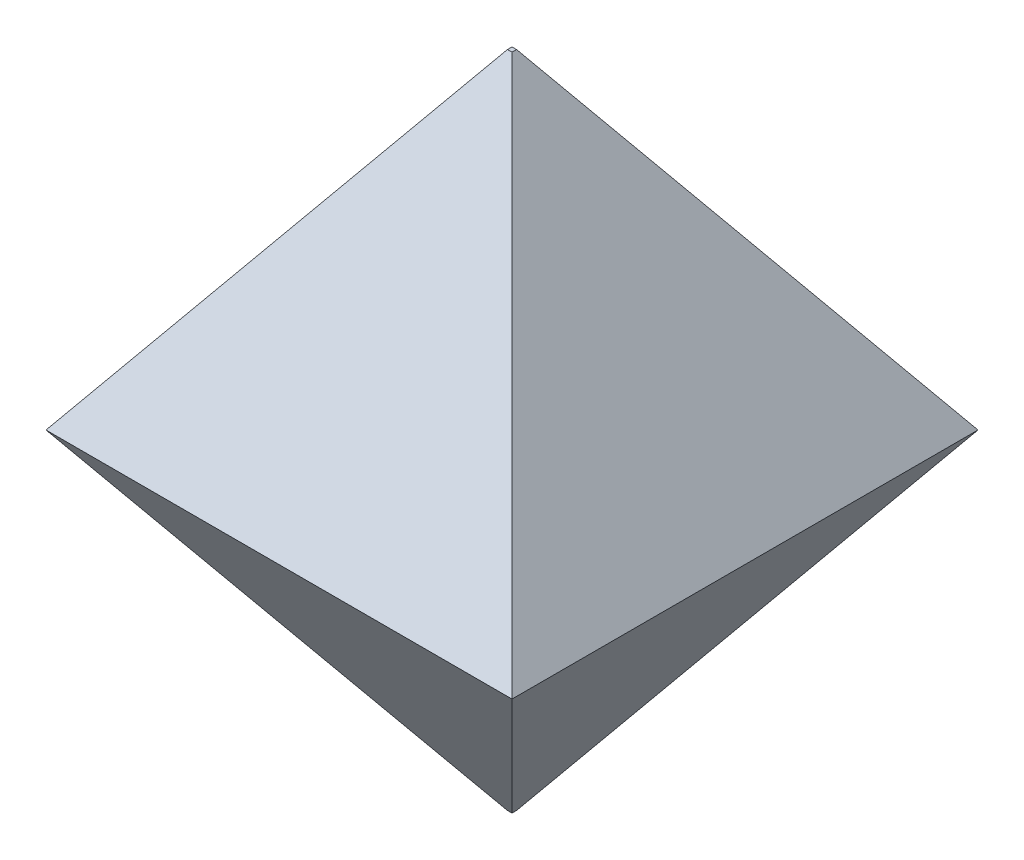
ISO-10303-21;
HEADER;
FILE_DESCRIPTION(('STEP AP214'),'2;1');
FILE_NAME('part.step','',(''),(''),'','','');
FILE_SCHEMA(('AUTOMOTIVE_DESIGN { 1 0 10303 214 1 1 1 1 }'));
ENDSEC;
DATA;
#1=APPLICATION_CONTEXT('core data for automotive mechanical design processes');
#2=APPLICATION_PROTOCOL_DEFINITION('international standard','automotive_design',2000,#1);
#3=PRODUCT_CONTEXT('',#1,'mechanical');
#4=PRODUCT('Part','Part','',(#3));
#5=PRODUCT_RELATED_PRODUCT_CATEGORY('part','',(#4));
#6=PRODUCT_DEFINITION_FORMATION('','',#4);
#7=PRODUCT_DEFINITION_CONTEXT('part definition',#1,'design');
#8=PRODUCT_DEFINITION('design','',#6,#7);
#9=PRODUCT_DEFINITION_SHAPE('','',#8);
#10=(LENGTH_UNIT() NAMED_UNIT(*) SI_UNIT(.MILLI.,.METRE.));
#11=(NAMED_UNIT(*) PLANE_ANGLE_UNIT() SI_UNIT($,.RADIAN.));
#12=(NAMED_UNIT(*) SI_UNIT($,.STERADIAN.) SOLID_ANGLE_UNIT());
#13=UNCERTAINTY_MEASURE_WITH_UNIT(LENGTH_MEASURE(1.E-05),#10,'distance_accuracy_value','');
#14=(GEOMETRIC_REPRESENTATION_CONTEXT(3) GLOBAL_UNCERTAINTY_ASSIGNED_CONTEXT((#13)) GLOBAL_UNIT_ASSIGNED_CONTEXT((#10,
#11,#12)) REPRESENTATION_CONTEXT('',''));
#15=CARTESIAN_POINT('',(0.,0.,0.));
#16=DIRECTION('',(0.,0.,1.));
#17=DIRECTION('',(1.,0.,0.));
#18=AXIS2_PLACEMENT_3D('',#15,#16,#17);
#19=CARTESIAN_POINT('',(0.,0.,0.));
#20=DIRECTION('',(-0.819152044288991,-0.573576436351046,0.));
#21=DIRECTION('',(0.573576436351046,-0.819152044288991,0.));
#22=AXIS2_PLACEMENT_3D('',#19,#20,#21);
#23=PLANE('',#22);
#24=DIRECTION('',(0.,0.,1.));
#25=VECTOR('',#24,1.);
#26=CARTESIAN_POINT('',(0.,0.,0.));
#27=LINE('',#26,#25);
#28=CARTESIAN_POINT('',(0.,0.,0.));
#29=VERTEX_POINT('',#28);
#30=CARTESIAN_POINT('',(0.,0.,25.4));
#31=VERTEX_POINT('',#30);
#32=EDGE_CURVE('E93',#29,#31,#27,.T.);
#33=ORIENTED_EDGE('',*,*,#32,.F.);
#34=DIRECTION('',(-0.497542812164523,0.710564775461629,-0.497542812164523));
#35=VECTOR('',#34,1.);
#36=CARTESIAN_POINT('',(0.,0.,0.));
#37=LINE('',#36,#35);
#38=CARTESIAN_POINT('',(12.5757273862464,-17.96,12.5757273862464));
#39=VERTEX_POINT('',#38);
#40=EDGE_CURVE('E11',#39,#29,#37,.T.);
#41=ORIENTED_EDGE('',*,*,#40,.F.);
#42=DIRECTION('',(0.,0.,1.));
#43=VECTOR('',#42,1.);
#44=CARTESIAN_POINT('',(12.5757273862464,-17.96,0.));
#45=LINE('',#44,#43);
#46=CARTESIAN_POINT('',(12.5757273862464,-17.96,12.8242726137536));
#47=VERTEX_POINT('',#46);
#48=EDGE_CURVE('E116',#39,#47,#45,.T.);
#49=ORIENTED_EDGE('',*,*,#48,.T.);
#50=DIRECTION('',(-0.497542812164523,0.710564775461629,0.497542812164523));
#51=VECTOR('',#50,1.);
#52=CARTESIAN_POINT('',(6.28774078838918,-8.97982447384909,19.1122592116108));
#53=LINE('',#52,#51);
#54=EDGE_CURVE('E71',#47,#31,#53,.T.);
#55=ORIENTED_EDGE('',*,*,#54,.T.);
#56=EDGE_LOOP('',(#33,#41,#49,#55));
#57=FACE_BOUND('',#56,.T.);
#58=ADVANCED_FACE('F34',(#57),#23,.T.);
#59=CARTESIAN_POINT('',(0.,0.,0.));
#60=DIRECTION('',(0.,-0.573576436351046,-0.819152044288991));
#61=DIRECTION('',(0.,0.819152044288991,-0.573576436351046));
#62=AXIS2_PLACEMENT_3D('',#59,#60,#61);
#63=PLANE('',#62);
#64=DIRECTION('',(-1.,0.,0.));
#65=VECTOR('',#64,1.);
#66=CARTESIAN_POINT('',(0.,0.,0.));
#67=LINE('',#66,#65);
#68=CARTESIAN_POINT('',(25.4,0.,0.));
#69=VERTEX_POINT('',#68);
#70=EDGE_CURVE('E103',#69,#29,#67,.T.);
#71=ORIENTED_EDGE('',*,*,#70,.F.);
#72=DIRECTION('',(0.497542812164523,0.710564775461629,-0.497542812164523));
#73=VECTOR('',#72,1.);
#74=CARTESIAN_POINT('',(25.4,0.,0.));
#75=LINE('',#74,#73);
#76=CARTESIAN_POINT('',(12.8242726137536,-17.96,12.5757273862464));
#77=VERTEX_POINT('',#76);
#78=EDGE_CURVE('E44',#77,#69,#75,.T.);
#79=ORIENTED_EDGE('',*,*,#78,.F.);
#80=DIRECTION('',(-1.,0.,0.));
#81=VECTOR('',#80,1.);
#82=CARTESIAN_POINT('',(0.,-17.96,12.5757273862464));
#83=LINE('',#82,#81);
#84=EDGE_CURVE('E106',#77,#39,#83,.T.);
#85=ORIENTED_EDGE('',*,*,#84,.T.);
#86=ORIENTED_EDGE('',*,*,#40,.T.);
#87=EDGE_LOOP('',(#71,#79,#85,#86));
#88=FACE_BOUND('',#87,.T.);
#89=ADVANCED_FACE('F36',(#88),#63,.T.);
#90=CARTESIAN_POINT('',(25.4,0.,0.));
#91=DIRECTION('',(0.819152044288991,-0.573576436351046,0.));
#92=DIRECTION('',(0.573576436351046,0.819152044288991,0.));
#93=AXIS2_PLACEMENT_3D('',#90,#91,#92);
#94=PLANE('',#93);
#95=DIRECTION('',(0.,0.,-1.));
#96=VECTOR('',#95,1.);
#97=CARTESIAN_POINT('',(25.4,0.,0.));
#98=LINE('',#97,#96);
#99=CARTESIAN_POINT('',(25.4,0.,25.4));
#100=VERTEX_POINT('',#99);
#101=EDGE_CURVE('E117',#100,#69,#98,.T.);
#102=ORIENTED_EDGE('',*,*,#101,.F.);
#103=DIRECTION('',(0.497542812164523,0.710564775461629,0.497542812164523));
#104=VECTOR('',#103,1.);
#105=CARTESIAN_POINT('',(19.1122592116108,-8.97982447384909,19.1122592116108));
#106=LINE('',#105,#104);
#107=CARTESIAN_POINT('',(12.8242726137536,-17.96,12.8242726137536));
#108=VERTEX_POINT('',#107);
#109=EDGE_CURVE('E64',#108,#100,#106,.T.);
#110=ORIENTED_EDGE('',*,*,#109,.F.);
#111=DIRECTION('',(0.,0.,-1.));
#112=VECTOR('',#111,1.);
#113=CARTESIAN_POINT('',(12.8242726137536,-17.96,0.));
#114=LINE('',#113,#112);
#115=EDGE_CURVE('E143',#108,#77,#114,.T.);
#116=ORIENTED_EDGE('',*,*,#115,.T.);
#117=ORIENTED_EDGE('',*,*,#78,.T.);
#118=EDGE_LOOP('',(#102,#110,#116,#117));
#119=FACE_BOUND('',#118,.T.);
#120=ADVANCED_FACE('F155',(#119),#94,.T.);
#121=CARTESIAN_POINT('',(0.,0.,25.4));
#122=DIRECTION('',(0.,-0.573576436351046,0.819152044288991));
#123=DIRECTION('',(0.,-0.819152044288991,-0.573576436351046));
#124=AXIS2_PLACEMENT_3D('',#121,#122,#123);
#125=PLANE('',#124);
#126=DIRECTION('',(1.,0.,0.));
#127=VECTOR('',#126,1.);
#128=CARTESIAN_POINT('',(0.,0.,25.4));
#129=LINE('',#128,#127);
#130=EDGE_CURVE('E97',#31,#100,#129,.T.);
#131=ORIENTED_EDGE('',*,*,#130,.F.);
#132=ORIENTED_EDGE('',*,*,#54,.F.);
#133=DIRECTION('',(1.,0.,0.));
#134=VECTOR('',#133,1.);
#135=CARTESIAN_POINT('',(0.,-17.96,12.8242726137536));
#136=LINE('',#135,#134);
#137=EDGE_CURVE('E38',#47,#108,#136,.T.);
#138=ORIENTED_EDGE('',*,*,#137,.T.);
#139=ORIENTED_EDGE('',*,*,#109,.T.);
#140=EDGE_LOOP('',(#131,#132,#138,#139));
#141=FACE_BOUND('',#140,.T.);
#142=ADVANCED_FACE('F144',(#141),#125,.T.);
#143=CARTESIAN_POINT('',(0.,-17.96,0.));
#144=DIRECTION('',(0.,1.,0.));
#145=DIRECTION('',(0.,0.,1.));
#146=AXIS2_PLACEMENT_3D('',#143,#144,#145);
#147=PLANE('',#146);
#148=ORIENTED_EDGE('',*,*,#48,.F.);
#149=ORIENTED_EDGE('',*,*,#84,.F.);
#150=ORIENTED_EDGE('',*,*,#115,.F.);
#151=ORIENTED_EDGE('',*,*,#137,.F.);
#152=EDGE_LOOP('',(#148,#149,#150,#151));
#153=FACE_BOUND('',#152,.T.);
#154=ADVANCED_FACE('F146',(#153),#147,.F.);
#155=CARTESIAN_POINT('',(0.,0.,0.));
#156=DIRECTION('',(-0.819152044288991,0.573576436351046,0.));
#157=DIRECTION('',(-0.573576436351046,-0.819152044288991,0.));
#158=AXIS2_PLACEMENT_3D('',#155,#156,#157);
#159=PLANE('',#158);
#160=ORIENTED_EDGE('',*,*,#32,.T.);
#161=DIRECTION('',(-0.497542812164523,-0.710564775461629,0.497542812164523));
#162=VECTOR('',#161,1.);
#163=CARTESIAN_POINT('',(0.,0.,25.4));
#164=LINE('',#163,#162);
#165=CARTESIAN_POINT('',(12.5757273862464,17.96,12.8242726137536));
#166=VERTEX_POINT('',#165);
#167=EDGE_CURVE('E98',#166,#31,#164,.T.);
#168=ORIENTED_EDGE('',*,*,#167,.F.);
#169=DIRECTION('',(0.,0.,-1.));
#170=VECTOR('',#169,1.);
#171=CARTESIAN_POINT('',(12.5757273862464,17.96,0.));
#172=LINE('',#171,#170);
#173=CARTESIAN_POINT('',(12.5757273862464,17.96,12.5757273862464));
#174=VERTEX_POINT('',#173);
#175=EDGE_CURVE('E121',#174,#166,#172,.F.);
#176=ORIENTED_EDGE('',*,*,#175,.F.);
#177=DIRECTION('',(-0.497542812164523,-0.710564775461629,-0.497542812164523));
#178=VECTOR('',#177,1.);
#179=CARTESIAN_POINT('',(0.,0.,0.));
#180=LINE('',#179,#178);
#181=EDGE_CURVE('E112',#174,#29,#180,.T.);
#182=ORIENTED_EDGE('',*,*,#181,.T.);
#183=EDGE_LOOP('',(#160,#168,#176,#182));
#184=FACE_BOUND('',#183,.T.);
#185=ADVANCED_FACE('F119',(#184),#159,.T.);
#186=CARTESIAN_POINT('',(0.,0.,25.4));
#187=DIRECTION('',(0.,0.573576436351046,0.819152044288991));
#188=DIRECTION('',(0.,-0.819152044288991,0.573576436351046));
#189=AXIS2_PLACEMENT_3D('',#186,#187,#188);
#190=PLANE('',#189);
#191=ORIENTED_EDGE('',*,*,#130,.T.);
#192=DIRECTION('',(0.497542812164523,-0.710564775461629,0.497542812164523));
#193=VECTOR('',#192,1.);
#194=CARTESIAN_POINT('',(19.1122592116108,8.97982447384909,19.1122592116108));
#195=LINE('',#194,#193);
#196=CARTESIAN_POINT('',(12.8242726137536,17.96,12.8242726137536));
#197=VERTEX_POINT('',#196);
#198=EDGE_CURVE('E124',#197,#100,#195,.T.);
#199=ORIENTED_EDGE('',*,*,#198,.F.);
#200=DIRECTION('',(-1.,0.,0.));
#201=VECTOR('',#200,1.);
#202=CARTESIAN_POINT('',(0.,17.96,12.8242726137536));
#203=LINE('',#202,#201);
#204=EDGE_CURVE('E133',#166,#197,#203,.F.);
#205=ORIENTED_EDGE('',*,*,#204,.F.);
#206=ORIENTED_EDGE('',*,*,#167,.T.);
#207=EDGE_LOOP('',(#191,#199,#205,#206));
#208=FACE_BOUND('',#207,.T.);
#209=ADVANCED_FACE('F153',(#208),#190,.T.);
#210=CARTESIAN_POINT('',(25.4,0.,0.));
#211=DIRECTION('',(0.819152044288991,0.573576436351046,0.));
#212=DIRECTION('',(-0.573576436351046,0.819152044288991,0.));
#213=AXIS2_PLACEMENT_3D('',#210,#211,#212);
#214=PLANE('',#213);
#215=ORIENTED_EDGE('',*,*,#101,.T.);
#216=DIRECTION('',(0.497542812164523,-0.710564775461629,-0.497542812164523));
#217=VECTOR('',#216,1.);
#218=CARTESIAN_POINT('',(19.1122592116108,8.97982447384909,6.28774078838918));
#219=LINE('',#218,#217);
#220=CARTESIAN_POINT('',(12.8242726137536,17.96,12.5757273862464));
#221=VERTEX_POINT('',#220);
#222=EDGE_CURVE('E115',#221,#69,#219,.T.);
#223=ORIENTED_EDGE('',*,*,#222,.F.);
#224=DIRECTION('',(0.,0.,1.));
#225=VECTOR('',#224,1.);
#226=CARTESIAN_POINT('',(12.8242726137536,17.96,0.));
#227=LINE('',#226,#225);
#228=EDGE_CURVE('E126',#197,#221,#227,.F.);
#229=ORIENTED_EDGE('',*,*,#228,.F.);
#230=ORIENTED_EDGE('',*,*,#198,.T.);
#231=EDGE_LOOP('',(#215,#223,#229,#230));
#232=FACE_BOUND('',#231,.T.);
#233=ADVANCED_FACE('F171',(#232),#214,.T.);
#234=CARTESIAN_POINT('',(0.,0.,0.));
#235=DIRECTION('',(0.,0.573576436351046,-0.819152044288991));
#236=DIRECTION('',(0.,0.819152044288991,0.573576436351046));
#237=AXIS2_PLACEMENT_3D('',#234,#235,#236);
#238=PLANE('',#237);
#239=ORIENTED_EDGE('',*,*,#70,.T.);
#240=ORIENTED_EDGE('',*,*,#181,.F.);
#241=DIRECTION('',(1.,0.,0.));
#242=VECTOR('',#241,1.);
#243=CARTESIAN_POINT('',(0.,17.96,12.5757273862464));
#244=LINE('',#243,#242);
#245=EDGE_CURVE('E122',#221,#174,#244,.F.);
#246=ORIENTED_EDGE('',*,*,#245,.F.);
#247=ORIENTED_EDGE('',*,*,#222,.T.);
#248=EDGE_LOOP('',(#239,#240,#246,#247));
#249=FACE_BOUND('',#248,.T.);
#250=ADVANCED_FACE('F110',(#249),#238,.T.);
#251=CARTESIAN_POINT('',(0.,17.96,0.));
#252=DIRECTION('',(0.,1.,0.));
#253=DIRECTION('',(0.,0.,1.));
#254=AXIS2_PLACEMENT_3D('',#251,#252,#253);
#255=PLANE('',#254);
#256=ORIENTED_EDGE('',*,*,#175,.T.);
#257=ORIENTED_EDGE('',*,*,#204,.T.);
#258=ORIENTED_EDGE('',*,*,#228,.T.);
#259=ORIENTED_EDGE('',*,*,#245,.T.);
#260=EDGE_LOOP('',(#256,#257,#258,#259));
#261=FACE_BOUND('',#260,.T.);
#262=ADVANCED_FACE('F173',(#261),#255,.T.);
#263=CLOSED_SHELL('',(#58,#89,#120,#142,#154,#185,#209,#233,#250,#262));
#264=MANIFOLD_SOLID_BREP('B2',#263);
#265=ADVANCED_BREP_SHAPE_REPRESENTATION('',(#18,#264),#14);
#266=SHAPE_DEFINITION_REPRESENTATION(#9,#265);
ENDSEC;
END-ISO-10303-21;
